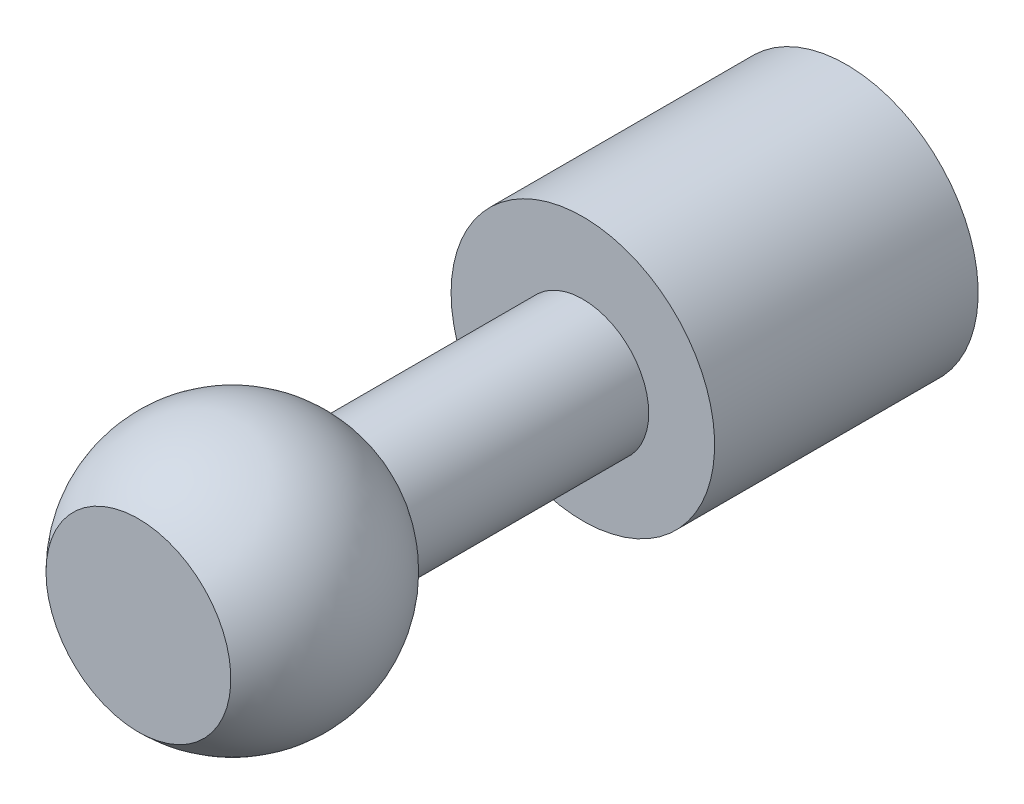
ISO-10303-21;
HEADER;
FILE_DESCRIPTION(('STEP AP214'),'2;1');
FILE_NAME('part.step','',(''),(''),'','','');
FILE_SCHEMA(('AUTOMOTIVE_DESIGN { 1 0 10303 214 1 1 1 1 }'));
ENDSEC;
DATA;
#1=APPLICATION_CONTEXT('core data for automotive mechanical design processes');
#2=APPLICATION_PROTOCOL_DEFINITION('international standard','automotive_design',2000,#1);
#3=PRODUCT_CONTEXT('',#1,'mechanical');
#4=PRODUCT('Part','Part','',(#3));
#5=PRODUCT_RELATED_PRODUCT_CATEGORY('part','',(#4));
#6=PRODUCT_DEFINITION_FORMATION('','',#4);
#7=PRODUCT_DEFINITION_CONTEXT('part definition',#1,'design');
#8=PRODUCT_DEFINITION('design','',#6,#7);
#9=PRODUCT_DEFINITION_SHAPE('','',#8);
#10=(LENGTH_UNIT() NAMED_UNIT(*) SI_UNIT(.MILLI.,.METRE.));
#11=(NAMED_UNIT(*) PLANE_ANGLE_UNIT() SI_UNIT($,.RADIAN.));
#12=(NAMED_UNIT(*) SI_UNIT($,.STERADIAN.) SOLID_ANGLE_UNIT());
#13=UNCERTAINTY_MEASURE_WITH_UNIT(LENGTH_MEASURE(1.E-05),#10,'distance_accuracy_value','');
#14=(GEOMETRIC_REPRESENTATION_CONTEXT(3) GLOBAL_UNCERTAINTY_ASSIGNED_CONTEXT((#13)) GLOBAL_UNIT_ASSIGNED_CONTEXT((#10,
#11,#12)) REPRESENTATION_CONTEXT('',''));
#15=CARTESIAN_POINT('',(0.,0.,0.));
#16=DIRECTION('',(0.,0.,1.));
#17=DIRECTION('',(1.,0.,0.));
#18=AXIS2_PLACEMENT_3D('',#15,#16,#17);
#19=CARTESIAN_POINT('',(0.,0.,13.3));
#20=DIRECTION('',(0.,-1.,0.));
#21=DIRECTION('',(0.,0.,1.));
#22=AXIS2_PLACEMENT_3D('',#19,#20,#21);
#23=SPHERICAL_SURFACE('',#22,5.);
#24=CARTESIAN_POINT('',(0.,0.,16.864022344005));
#25=DIRECTION('',(0.,0.,-1.));
#26=DIRECTION('',(-1.,0.,0.));
#27=AXIS2_PLACEMENT_3D('',#24,#25,#26);
#28=CIRCLE('',#27,3.50681404289322);
#29=CARTESIAN_POINT('',(-3.50681404289322,0.,16.864022344005));
#30=VERTEX_POINT('',#29);
#31=EDGE_CURVE('E46',#30,#30,#28,.F.);
#32=ORIENTED_EDGE('',*,*,#31,.F.);
#33=EDGE_LOOP('',(#32));
#34=FACE_BOUND('',#33,.T.);
#35=CARTESIAN_POINT('',(-1.77602790996407,-1.96988727482178,9.06145437826543));
#36=CARTESIAN_POINT('',(-1.87494034893032,-1.87003493932701,9.05649727945166));
#37=CARTESIAN_POINT('',(-1.96547539923106,-1.76175894134771,9.05113071931937));
#38=CARTESIAN_POINT('',(-2.12712823619466,-1.53146618434918,9.03974101528881));
#39=CARTESIAN_POINT('',(-2.19822221636372,-1.40943283464551,9.03371707891347));
#40=CARTESIAN_POINT('',(-2.31885961392762,-1.15522905840309,9.02119771802555));
#41=CARTESIAN_POINT('',(-2.36841421014884,-1.02306393220295,9.01470254013233));
#42=CARTESIAN_POINT('',(-2.44460578770369,-0.752338303756468,9.00142971841033));
#43=CARTESIAN_POINT('',(-2.47124848189725,-0.613779404819218,8.99465214543618));
#44=CARTESIAN_POINT('',(-2.50090167674704,-0.334054850993225,8.98100248621725));
#45=CARTESIAN_POINT('',(-2.50389464689138,-0.192887340129234,8.97413033364378));
#46=CARTESIAN_POINT('',(-2.48611565699737,0.0879541067977621,8.96049107008387));
#47=CARTESIAN_POINT('',(-2.46534269905109,0.227627979895824,8.9537239635203));
#48=CARTESIAN_POINT('',(-2.40060897223312,0.501538122326283,8.94048307266766));
#49=CARTESIAN_POINT('',(-2.35664377564984,0.635773348076262,8.93400934464488));
#50=CARTESIAN_POINT('',(-2.2467632809592,0.894961135530849,8.92153553045008));
#51=CARTESIAN_POINT('',(-2.18084806909834,1.01991373370661,8.91553544241714));
#52=CARTESIAN_POINT('',(-2.02897198931706,1.25691458947084,8.90417595935415));
#53=CARTESIAN_POINT('',(-1.94302188334831,1.36896972696243,8.89881622268239));
#54=CARTESIAN_POINT('',(-1.75349002532119,1.57705808094864,8.88887875038731));
#55=CARTESIAN_POINT('',(-1.64990839597983,1.67309140894731,8.88430100932166));
#56=CARTESIAN_POINT('',(-1.42816682500091,1.84630360090419,8.87605466982379));
#57=CARTESIAN_POINT('',(-1.3100219713263,1.92350173566711,8.8723851421176));
#58=CARTESIAN_POINT('',(-1.06242298599053,2.05696531828011,8.86604688263844));
#59=CARTESIAN_POINT('',(-0.932968911222566,2.11323087142807,8.86337814583116));
#60=CARTESIAN_POINT('',(-0.666575729761742,2.20317049200307,8.85911453321384));
#61=CARTESIAN_POINT('',(-0.529644799083937,2.23686872237942,8.85751850883838));
#62=CARTESIAN_POINT('',(-0.252061612761927,2.2808066218297,8.85543785487785));
#63=CARTESIAN_POINT('',(-0.111409375522686,2.29104640690327,8.85495321979705));
#64=CARTESIAN_POINT('',(0.16952305918947,2.28777573287655,8.85510805033751));
#65=CARTESIAN_POINT('',(0.309803443195077,2.27428123428084,8.85574676054697));
#66=CARTESIAN_POINT('',(0.586104645446052,2.22395870215597,8.8581300018445));
#67=CARTESIAN_POINT('',(0.72212546801494,2.1871306923115,8.85987453181011));
#68=CARTESIAN_POINT('',(0.9860485806684,2.09119308444524,8.86442340690805));
#69=CARTESIAN_POINT('',(1.11395088492949,2.03208352533264,8.86722775018969));
#70=CARTESIAN_POINT('',(1.35801430572828,1.89326871260283,8.87382209039443));
#71=CARTESIAN_POINT('',(1.47417539115758,1.81356340441908,8.87761208992893));
#72=CARTESIAN_POINT('',(1.69154485497768,1.63576640171834,8.88607990160903));
#73=CARTESIAN_POINT('',(1.79274317864789,1.53766244314361,8.89075830596824));
#74=CARTESIAN_POINT('',(1.97723598056629,1.32589343545574,8.90087607426011));
#75=CARTESIAN_POINT('',(2.06053035997138,1.21222830043896,8.90631544239359));
#76=CARTESIAN_POINT('',(2.20694622381942,0.972434137369369,8.91781459150834));
#77=CARTESIAN_POINT('',(2.27004602767288,0.846291902949198,8.92387503011066));
#78=CARTESIAN_POINT('',(2.37417312934767,0.585225498094172,8.93644612143356));
#79=CARTESIAN_POINT('',(2.41520029662798,0.450301275726556,8.94295677681655));
#80=CARTESIAN_POINT('',(2.47405847815452,0.175352098558445,8.95625552843767));
#81=CARTESIAN_POINT('',(2.49186556818533,0.0353220354955067,8.96304390340403));
#82=CARTESIAN_POINT('',(2.50370454824945,-0.245735903049334,8.97670175632587));
#83=CARTESIAN_POINT('',(2.4977363325155,-0.386763782967358,8.98357123464201));
#84=CARTESIAN_POINT('',(2.4621835630427,-0.665894861281081,8.99720000553947));
#85=CARTESIAN_POINT('',(2.43258614525673,-0.803996424499471,9.0039592360545));
#86=CARTESIAN_POINT('',(2.35059402063611,-1.07327341531484,9.0171687243845));
#87=CARTESIAN_POINT('',(2.29819933476912,-1.20444884928196,9.02361898248364));
#88=CARTESIAN_POINT('',(2.17210507670151,-1.45611860075226,9.03602040959022));
#89=CARTESIAN_POINT('',(2.09840981275986,-1.57661507175135,9.04197167920944));
#90=CARTESIAN_POINT('',(1.93179388370367,-1.80352534092062,9.05319975232534));
#91=CARTESIAN_POINT('',(1.8388732617298,-1.90993917069061,9.05847655733543));
#92=CARTESIAN_POINT('',(1.6365305650894,-2.1055592537485,9.06819229963498));
#93=CARTESIAN_POINT('',(1.52712329744266,-2.19478078560524,9.07263198078933));
#94=CARTESIAN_POINT('',(1.29484872035885,-2.35358571353797,9.08054399236868));
#95=CARTESIAN_POINT('',(1.17198147206184,-2.42316919881187,9.08401632718747));
#96=CARTESIAN_POINT('',(0.916430663017293,-2.54063634796105,9.08988319425356));
#97=CARTESIAN_POINT('',(0.783758861275694,-2.58854553070353,9.09227899396801));
#98=CARTESIAN_POINT('',(0.512245804660895,-2.66141169279464,9.09592446238361));
#99=CARTESIAN_POINT('',(0.373404830258944,-2.68636971446295,9.09717418313357));
#100=CARTESIAN_POINT('',(0.0936479760395589,-2.7126087917203,9.09848808058241));
#101=CARTESIAN_POINT('',(-0.0472655413274262,-2.71391498712439,9.09855351607253));
#102=CARTESIAN_POINT('',(-0.327348973799026,-2.69287178932697,9.09749974911125));
#103=CARTESIAN_POINT('',(-0.466518450808181,-2.67051656839752,9.09638025481559));
#104=CARTESIAN_POINT('',(-0.739140581915075,-2.60278544175683,9.09299121865289));
#105=CARTESIAN_POINT('',(-0.872592003651297,-2.55740460033322,9.09072143021189));
#106=CARTESIAN_POINT('',(-1.12985724818831,-2.4449415124347,9.08510321302796));
#107=CARTESIAN_POINT('',(-1.25368246721771,-2.37788542749105,9.08175608463067));
#108=CARTESIAN_POINT('',(-1.444016062157,-2.25308386875984,9.07553622753562));
#109=CARTESIAN_POINT('',(-1.51454694937895,-2.20134377547805,9.07295962231988));
#110=CARTESIAN_POINT('',(-1.64980709689794,-2.0907834101673,9.06745955392479));
#111=CARTESIAN_POINT('',(-1.71453635771917,-2.03196313877804,9.06453609077677));
#112=CARTESIAN_POINT('',(-1.77602790996407,-1.96988727482178,9.06145437826543));
#113=B_SPLINE_CURVE_WITH_KNOTS('',3,(#35,#36,#37,#38,#39,#40,#41,#42,#43,#44,#45,#46,#47,#48,
#49,#50,#51,#52,#53,#54,#55,#56,#57,#58,#59,#60,#61,#62,#63,#64,#65,#66,#67,#68,#69,#70,#71,#72,
#73,#74,#75,#76,#77,#78,#79,#80,#81,#82,#83,#84,#85,#86,#87,#88,#89,#90,#91,#92,#93,#94,#95,#96,
#97,#98,#99,#100,#101,#102,#103,#104,#105,#106,#107,#108,#109,#110,#111,#112),.UNSPECIFIED.,.T.,
.F.,(4,2,2,2,2,2,2,2,2,2,2,2,2,2,2,2,2,2,2,2,2,2,2,2,2,2,2,2,2,2,2,2,2,2,2,2,2,2,4),(0.,
0.42159108752328,0.843696144342414,1.26558186853014,1.6873623690907,2.10945548789038,
2.53156633061485,2.95375778918094,3.37594758888225,3.79791112543293,4.21987172519887,
4.6413987778474,5.06292371004546,5.48399658863094,5.90506738504919,6.32585513382322,
6.74664245547746,7.16742904233482,7.58821674403895,8.0092859351809,8.43035745087906,
8.8518795178198,9.27340407768051,9.69536260236962,10.1173230041934,10.5395132835671,
10.9617031746343,11.3838077331778,11.8059113445517,12.2276380902586,12.6493629204106,
13.0705899201017,13.491797788958,13.9125579245139,14.3334217160088,14.7543757609138,
15.1748236091452,15.4369169615857,15.6990102903456),.UNSPECIFIED.);
#114=CARTESIAN_POINT('',(-1.77602790996407,-1.96988727482178,9.06145437826543));
#115=VERTEX_POINT('',#114);
#116=EDGE_CURVE('E10',#115,#115,#113,.T.);
#117=ORIENTED_EDGE('',*,*,#116,.F.);
#118=EDGE_LOOP('',(#117));
#119=FACE_BOUND('',#118,.T.);
#120=ADVANCED_FACE('F37',(#34,#119),#23,.T.);
#121=CARTESIAN_POINT('',(0.,-0.210420064831851,9.1));
#122=DIRECTION('',(0.,0.,-1.));
#123=DIRECTION('',(-1.,0.,0.));
#124=AXIS2_PLACEMENT_3D('',#121,#122,#123);
#125=CYLINDRICAL_SURFACE('',#124,2.5);
#126=ORIENTED_EDGE('',*,*,#116,.T.);
#127=EDGE_LOOP('',(#126));
#128=FACE_BOUND('',#127,.T.);
#129=CARTESIAN_POINT('',(0.,-0.210420064831851,0.));
#130=DIRECTION('',(0.,0.,1.));
#131=DIRECTION('',(1.,0.,0.));
#132=AXIS2_PLACEMENT_3D('',#129,#130,#131);
#133=CIRCLE('',#132,2.5);
#134=CARTESIAN_POINT('',(2.5,-0.210420064831851,0.));
#135=VERTEX_POINT('',#134);
#136=EDGE_CURVE('E51',#135,#135,#133,.T.);
#137=ORIENTED_EDGE('',*,*,#136,.T.);
#138=EDGE_LOOP('',(#137));
#139=FACE_BOUND('',#138,.T.);
#140=ADVANCED_FACE('F39',(#128,#139),#125,.T.);
#141=CARTESIAN_POINT('',(-5.,0.,16.864022344005));
#142=DIRECTION('',(0.,0.,-1.));
#143=DIRECTION('',(-1.,0.,0.));
#144=AXIS2_PLACEMENT_3D('',#141,#142,#143);
#145=PLANE('',#144);
#146=ORIENTED_EDGE('',*,*,#31,.T.);
#147=EDGE_LOOP('',(#146));
#148=FACE_BOUND('',#147,.T.);
#149=ADVANCED_FACE('F61',(#148),#145,.F.);
#150=CARTESIAN_POINT('',(0.,0.,-10.));
#151=DIRECTION('',(0.,0.,1.));
#152=DIRECTION('',(1.,0.,0.));
#153=AXIS2_PLACEMENT_3D('',#150,#151,#152);
#154=CYLINDRICAL_SURFACE('',#153,5.);
#155=CARTESIAN_POINT('',(0.,0.,-10.));
#156=DIRECTION('',(0.,0.,-1.));
#157=DIRECTION('',(-1.,0.,0.));
#158=AXIS2_PLACEMENT_3D('',#155,#156,#157);
#159=CIRCLE('',#158,5.);
#160=CARTESIAN_POINT('',(-5.,0.,-10.));
#161=VERTEX_POINT('',#160);
#162=EDGE_CURVE('E94',#161,#161,#159,.T.);
#163=ORIENTED_EDGE('',*,*,#162,.F.);
#164=EDGE_LOOP('',(#163));
#165=FACE_BOUND('',#164,.T.);
#166=CARTESIAN_POINT('',(0.,0.,0.));
#167=DIRECTION('',(0.,0.,-1.));
#168=DIRECTION('',(-1.,0.,0.));
#169=AXIS2_PLACEMENT_3D('',#166,#167,#168);
#170=CIRCLE('',#169,5.);
#171=CARTESIAN_POINT('',(-5.,0.,0.));
#172=VERTEX_POINT('',#171);
#173=EDGE_CURVE('E92',#172,#172,#170,.T.);
#174=ORIENTED_EDGE('',*,*,#173,.T.);
#175=EDGE_LOOP('',(#174));
#176=FACE_BOUND('',#175,.T.);
#177=ADVANCED_FACE('F64',(#165,#176),#154,.T.);
#178=CARTESIAN_POINT('',(0.,0.,-10.));
#179=DIRECTION('',(0.,0.,-1.));
#180=DIRECTION('',(-1.,0.,0.));
#181=AXIS2_PLACEMENT_3D('',#178,#179,#180);
#182=PLANE('',#181);
#183=CARTESIAN_POINT('',(0.,0.,-10.));
#184=DIRECTION('',(0.,0.,-1.));
#185=DIRECTION('',(-1.,0.,0.));
#186=AXIS2_PLACEMENT_3D('',#183,#184,#185);
#187=CIRCLE('',#186,4.);
#188=CARTESIAN_POINT('',(4.,0.,-10.));
#189=VERTEX_POINT('',#188);
#190=EDGE_CURVE('E42',#189,#189,#187,.F.);
#191=ORIENTED_EDGE('',*,*,#190,.T.);
#192=EDGE_LOOP('',(#191));
#193=FACE_BOUND('',#192,.T.);
#194=ORIENTED_EDGE('',*,*,#162,.T.);
#195=EDGE_LOOP('',(#194));
#196=FACE_BOUND('',#195,.T.);
#197=ADVANCED_FACE('F68',(#193,#196),#182,.T.);
#198=CARTESIAN_POINT('',(0.,0.,0.));
#199=DIRECTION('',(0.,0.,-1.));
#200=DIRECTION('',(-1.,0.,0.));
#201=AXIS2_PLACEMENT_3D('',#198,#199,#200);
#202=PLANE('',#201);
#203=ORIENTED_EDGE('',*,*,#136,.F.);
#204=EDGE_LOOP('',(#203));
#205=FACE_BOUND('',#204,.T.);
#206=ORIENTED_EDGE('',*,*,#173,.F.);
#207=EDGE_LOOP('',(#206));
#208=FACE_BOUND('',#207,.T.);
#209=ADVANCED_FACE('F70',(#205,#208),#202,.F.);
#210=CARTESIAN_POINT('',(0.,0.,-10.000012));
#211=DIRECTION('',(0.,0.,1.));
#212=DIRECTION('',(1.,0.,0.));
#213=AXIS2_PLACEMENT_3D('',#210,#211,#212);
#214=CYLINDRICAL_SURFACE('',#213,4.);
#215=CARTESIAN_POINT('',(0.,0.,-2.));
#216=DIRECTION('',(0.,0.,-1.));
#217=DIRECTION('',(-1.,0.,0.));
#218=AXIS2_PLACEMENT_3D('',#215,#216,#217);
#219=CIRCLE('',#218,4.);
#220=CARTESIAN_POINT('',(4.,0.,-2.));
#221=VERTEX_POINT('',#220);
#222=EDGE_CURVE('E88',#221,#221,#219,.T.);
#223=CARTESIAN_POINT('',(4.,0.,-10.));
#224=CARTESIAN_POINT('',(4.,0.,-9.91666666666667));
#225=CARTESIAN_POINT('',(4.,0.,-9.83333333333333));
#226=CARTESIAN_POINT('',(4.,0.,-9.66666666666667));
#227=CARTESIAN_POINT('',(4.,0.,-9.58333333333333));
#228=CARTESIAN_POINT('',(4.,0.,-9.41666666666667));
#229=CARTESIAN_POINT('',(4.,0.,-9.33333333333333));
#230=CARTESIAN_POINT('',(4.,0.,-9.16666666666667));
#231=CARTESIAN_POINT('',(4.,0.,-9.08333333333333));
#232=CARTESIAN_POINT('',(4.,0.,-8.91666666666667));
#233=CARTESIAN_POINT('',(4.,0.,-8.83333333333333));
#234=CARTESIAN_POINT('',(4.,0.,-8.66666666666667));
#235=CARTESIAN_POINT('',(4.,0.,-8.58333333333333));
#236=CARTESIAN_POINT('',(4.,0.,-8.41666666666667));
#237=CARTESIAN_POINT('',(4.,0.,-8.33333333333333));
#238=CARTESIAN_POINT('',(4.,0.,-8.16666666666667));
#239=CARTESIAN_POINT('',(4.,0.,-8.08333333333333));
#240=CARTESIAN_POINT('',(4.,0.,-7.91666666666667));
#241=CARTESIAN_POINT('',(4.,0.,-7.83333333333333));
#242=CARTESIAN_POINT('',(4.,0.,-7.66666666666666));
#243=CARTESIAN_POINT('',(4.,0.,-7.58333333333333));
#244=CARTESIAN_POINT('',(4.,0.,-7.41666666666667));
#245=CARTESIAN_POINT('',(4.,0.,-7.33333333333333));
#246=CARTESIAN_POINT('',(4.,0.,-7.16666666666667));
#247=CARTESIAN_POINT('',(4.,0.,-7.08333333333333));
#248=CARTESIAN_POINT('',(4.,0.,-6.91666666666666));
#249=CARTESIAN_POINT('',(4.,0.,-6.83333333333333));
#250=CARTESIAN_POINT('',(4.,0.,-6.66666666666667));
#251=CARTESIAN_POINT('',(4.,0.,-6.58333333333333));
#252=CARTESIAN_POINT('',(4.,0.,-6.41666666666667));
#253=CARTESIAN_POINT('',(4.,0.,-6.33333333333333));
#254=CARTESIAN_POINT('',(4.,0.,-6.16666666666667));
#255=CARTESIAN_POINT('',(4.,0.,-6.08333333333333));
#256=CARTESIAN_POINT('',(4.,0.,-5.91666666666666));
#257=CARTESIAN_POINT('',(4.,0.,-5.83333333333333));
#258=CARTESIAN_POINT('',(4.,0.,-5.66666666666666));
#259=CARTESIAN_POINT('',(4.,0.,-5.58333333333333));
#260=CARTESIAN_POINT('',(4.,0.,-5.41666666666666));
#261=CARTESIAN_POINT('',(4.,0.,-5.33333333333333));
#262=CARTESIAN_POINT('',(4.,0.,-5.16666666666666));
#263=CARTESIAN_POINT('',(4.,0.,-5.08333333333333));
#264=CARTESIAN_POINT('',(4.,0.,-4.91666666666666));
#265=CARTESIAN_POINT('',(4.,0.,-4.83333333333333));
#266=CARTESIAN_POINT('',(4.,0.,-4.66666666666666));
#267=CARTESIAN_POINT('',(4.,0.,-4.58333333333333));
#268=CARTESIAN_POINT('',(4.,0.,-4.41666666666666));
#269=CARTESIAN_POINT('',(4.,0.,-4.33333333333333));
#270=CARTESIAN_POINT('',(4.,0.,-4.16666666666666));
#271=CARTESIAN_POINT('',(4.,0.,-4.08333333333333));
#272=CARTESIAN_POINT('',(4.,0.,-3.91666666666666));
#273=CARTESIAN_POINT('',(4.,0.,-3.83333333333333));
#274=CARTESIAN_POINT('',(4.,0.,-3.66666666666666));
#275=CARTESIAN_POINT('',(4.,0.,-3.58333333333333));
#276=CARTESIAN_POINT('',(4.,0.,-3.41666666666666));
#277=CARTESIAN_POINT('',(4.,0.,-3.33333333333333));
#278=CARTESIAN_POINT('',(4.,0.,-3.16666666666666));
#279=CARTESIAN_POINT('',(4.,0.,-3.08333333333333));
#280=CARTESIAN_POINT('',(4.,0.,-2.91666666666666));
#281=CARTESIAN_POINT('',(4.,0.,-2.83333333333333));
#282=CARTESIAN_POINT('',(4.,0.,-2.66666666666666));
#283=CARTESIAN_POINT('',(4.,0.,-2.58333333333333));
#284=CARTESIAN_POINT('',(4.,0.,-2.41666666666666));
#285=CARTESIAN_POINT('',(4.,0.,-2.33333333333333));
#286=CARTESIAN_POINT('',(4.,0.,-2.16666666666666));
#287=CARTESIAN_POINT('',(4.,0.,-2.08333333333333));
#288=CARTESIAN_POINT('',(4.,0.,-2.));
#289=B_SPLINE_CURVE_WITH_KNOTS('',3,(#223,#224,#225,#226,#227,#228,#229,#230,#231,#232,#233,
#234,#235,#236,#237,#238,#239,#240,#241,#242,#243,#244,#245,#246,#247,#248,#249,#250,#251,#252,
#253,#254,#255,#256,#257,#258,#259,#260,#261,#262,#263,#264,#265,#266,#267,#268,#269,#270,#271,
#272,#273,#274,#275,#276,#277,#278,#279,#280,#281,#282,#283,#284,#285,#286,#287,#288),
.UNSPECIFIED.,.F.,.F.,(4,2,2,2,2,2,2,2,2,2,2,2,2,2,2,2,2,2,2,2,2,2,2,2,2,2,2,2,2,2,2,2,4),(0.,
0.25,0.5,0.750000000000001,1.,1.25,1.5,1.75,2.,2.25,2.5,2.75,3.,3.25,3.5,3.75,4.,4.25,4.5,4.75,
5.,5.25,5.5,5.75,6.,6.25,6.5,6.75,7.,7.25,7.5,7.75,8.),.UNSPECIFIED.);
#290=EDGE_CURVE('BSEAM73',#189,#221,#289,.T.);
#291=ORIENTED_EDGE('',*,*,#190,.F.);
#292=ORIENTED_EDGE('',*,*,#222,.F.);
#293=ORIENTED_EDGE('',*,*,#290,.T.);
#294=ORIENTED_EDGE('',*,*,#290,.F.);
#295=EDGE_LOOP('',(#291,#293,#292,#294));
#296=FACE_BOUND('',#295,.T.);
#297=ADVANCED_FACE('F73',(#296),#214,.F.);
#298=CARTESIAN_POINT('',(0.,0.,-2.));
#299=DIRECTION('',(0.,0.,-1.));
#300=DIRECTION('',(-1.,0.,0.));
#301=AXIS2_PLACEMENT_3D('',#298,#299,#300);
#302=PLANE('',#301);
#303=ORIENTED_EDGE('',*,*,#222,.T.);
#304=EDGE_LOOP('',(#303));
#305=FACE_BOUND('',#304,.T.);
#306=ADVANCED_FACE('F80',(#305),#302,.T.);
#307=CLOSED_SHELL('',(#120,#140,#149,#177,#197,#209,#297,#306));
#308=MANIFOLD_SOLID_BREP('B2',#307);
#309=ADVANCED_BREP_SHAPE_REPRESENTATION('',(#18,#308),#14);
#310=SHAPE_DEFINITION_REPRESENTATION(#9,#309);
ENDSEC;
END-ISO-10303-21;
